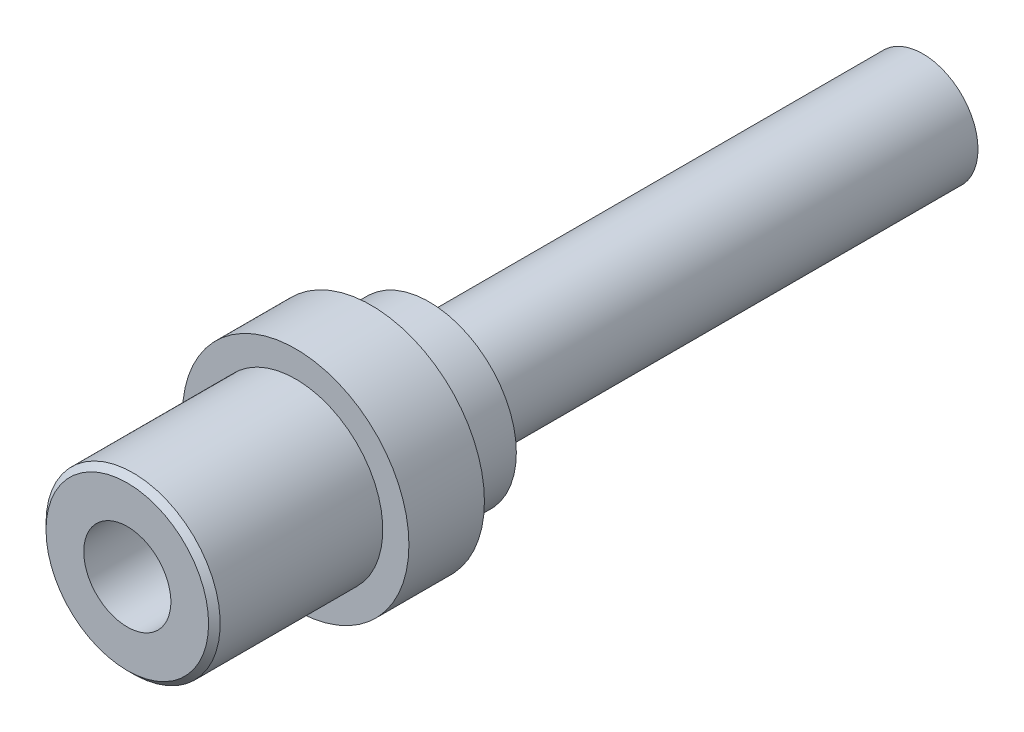
ISO-10303-21;
HEADER;
FILE_DESCRIPTION(('STEP AP214'),'2;1');
FILE_NAME('part.step','',(''),(''),'','','');
FILE_SCHEMA(('AUTOMOTIVE_DESIGN { 1 0 10303 214 1 1 1 1 }'));
ENDSEC;
DATA;
#1=APPLICATION_CONTEXT('core data for automotive mechanical design processes');
#2=APPLICATION_PROTOCOL_DEFINITION('international standard','automotive_design',2000,#1);
#3=PRODUCT_CONTEXT('',#1,'mechanical');
#4=PRODUCT('Part','Part','',(#3));
#5=PRODUCT_RELATED_PRODUCT_CATEGORY('part','',(#4));
#6=PRODUCT_DEFINITION_FORMATION('','',#4);
#7=PRODUCT_DEFINITION_CONTEXT('part definition',#1,'design');
#8=PRODUCT_DEFINITION('design','',#6,#7);
#9=PRODUCT_DEFINITION_SHAPE('','',#8);
#10=(LENGTH_UNIT() NAMED_UNIT(*) SI_UNIT(.MILLI.,.METRE.));
#11=(NAMED_UNIT(*) PLANE_ANGLE_UNIT() SI_UNIT($,.RADIAN.));
#12=(NAMED_UNIT(*) SI_UNIT($,.STERADIAN.) SOLID_ANGLE_UNIT());
#13=UNCERTAINTY_MEASURE_WITH_UNIT(LENGTH_MEASURE(1.E-05),#10,'distance_accuracy_value','');
#14=(GEOMETRIC_REPRESENTATION_CONTEXT(3) GLOBAL_UNCERTAINTY_ASSIGNED_CONTEXT((#13)) GLOBAL_UNIT_ASSIGNED_CONTEXT((#10,
#11,#12)) REPRESENTATION_CONTEXT('',''));
#15=CARTESIAN_POINT('',(0.,0.,0.));
#16=DIRECTION('',(0.,0.,1.));
#17=DIRECTION('',(1.,0.,0.));
#18=AXIS2_PLACEMENT_3D('',#15,#16,#17);
#19=CARTESIAN_POINT('',(0.,0.,85.));
#20=DIRECTION('',(0.,0.,-1.));
#21=DIRECTION('',(-1.,0.,0.));
#22=AXIS2_PLACEMENT_3D('',#19,#20,#21);
#23=CYLINDRICAL_SURFACE('',#22,9.5);
#24=CARTESIAN_POINT('',(0.,0.,85.));
#25=DIRECTION('',(0.,0.,1.));
#26=DIRECTION('',(1.,0.,0.));
#27=AXIS2_PLACEMENT_3D('',#24,#25,#26);
#28=CIRCLE('',#27,9.5);
#29=CARTESIAN_POINT('',(9.5,0.,85.));
#30=VERTEX_POINT('',#29);
#31=EDGE_CURVE('E62',#30,#30,#28,.T.);
#32=ORIENTED_EDGE('',*,*,#31,.F.);
#33=EDGE_LOOP('',(#32));
#34=FACE_BOUND('',#33,.T.);
#35=CARTESIAN_POINT('',(0.,0.,0.));
#36=DIRECTION('',(0.,0.,1.));
#37=DIRECTION('',(1.,0.,0.));
#38=AXIS2_PLACEMENT_3D('',#35,#36,#37);
#39=CIRCLE('',#38,9.5);
#40=CARTESIAN_POINT('',(9.5,0.,0.));
#41=VERTEX_POINT('',#40);
#42=EDGE_CURVE('E65',#41,#41,#39,.T.);
#43=ORIENTED_EDGE('',*,*,#42,.T.);
#44=EDGE_LOOP('',(#43));
#45=FACE_BOUND('',#44,.T.);
#46=ADVANCED_FACE('F43',(#34,#45),#23,.T.);
#47=CARTESIAN_POINT('',(0.,0.,0.));
#48=DIRECTION('',(0.,0.,1.));
#49=DIRECTION('',(1.,0.,0.));
#50=AXIS2_PLACEMENT_3D('',#47,#48,#49);
#51=PLANE('',#50);
#52=CARTESIAN_POINT('',(0.,0.,0.));
#53=DIRECTION('',(0.,0.,-1.));
#54=DIRECTION('',(-1.,0.,0.));
#55=AXIS2_PLACEMENT_3D('',#52,#53,#54);
#56=CIRCLE('',#55,7.5);
#57=CARTESIAN_POINT('',(-7.5,0.,0.));
#58=VERTEX_POINT('',#57);
#59=EDGE_CURVE('E89',#58,#58,#56,.T.);
#60=ORIENTED_EDGE('',*,*,#59,.F.);
#61=EDGE_LOOP('',(#60));
#62=FACE_BOUND('',#61,.T.);
#63=ORIENTED_EDGE('',*,*,#42,.F.);
#64=EDGE_LOOP('',(#63));
#65=FACE_BOUND('',#64,.T.);
#66=ADVANCED_FACE('F105',(#62,#65),#51,.F.);
#67=CARTESIAN_POINT('',(0.,0.,95.));
#68=DIRECTION('',(0.,0.,-1.));
#69=DIRECTION('',(-1.,0.,0.));
#70=AXIS2_PLACEMENT_3D('',#67,#68,#69);
#71=CYLINDRICAL_SURFACE('',#70,15.);
#72=CARTESIAN_POINT('',(0.,0.,95.));
#73=DIRECTION('',(0.,0.,1.));
#74=DIRECTION('',(1.,0.,0.));
#75=AXIS2_PLACEMENT_3D('',#72,#73,#74);
#76=CIRCLE('',#75,15.);
#77=CARTESIAN_POINT('',(15.,0.,95.));
#78=VERTEX_POINT('',#77);
#79=EDGE_CURVE('E69',#78,#78,#76,.T.);
#80=ORIENTED_EDGE('',*,*,#79,.F.);
#81=EDGE_LOOP('',(#80));
#82=FACE_BOUND('',#81,.T.);
#83=CARTESIAN_POINT('',(0.,0.,85.));
#84=DIRECTION('',(0.,0.,1.));
#85=DIRECTION('',(1.,0.,0.));
#86=AXIS2_PLACEMENT_3D('',#83,#84,#85);
#87=CIRCLE('',#86,15.);
#88=CARTESIAN_POINT('',(15.,0.,85.));
#89=VERTEX_POINT('',#88);
#90=EDGE_CURVE('E73',#89,#89,#87,.T.);
#91=ORIENTED_EDGE('',*,*,#90,.T.);
#92=EDGE_LOOP('',(#91));
#93=FACE_BOUND('',#92,.T.);
#94=ADVANCED_FACE('F108',(#82,#93),#71,.T.);
#95=CARTESIAN_POINT('',(0.,0.,85.));
#96=DIRECTION('',(0.,0.,1.));
#97=DIRECTION('',(1.,0.,0.));
#98=AXIS2_PLACEMENT_3D('',#95,#96,#97);
#99=PLANE('',#98);
#100=ORIENTED_EDGE('',*,*,#31,.T.);
#101=EDGE_LOOP('',(#100));
#102=FACE_BOUND('',#101,.T.);
#103=ORIENTED_EDGE('',*,*,#90,.F.);
#104=EDGE_LOOP('',(#103));
#105=FACE_BOUND('',#104,.T.);
#106=ADVANCED_FACE('F120',(#102,#105),#99,.F.);
#107=CARTESIAN_POINT('',(0.,0.,108.));
#108=DIRECTION('',(0.,0.,-1.));
#109=DIRECTION('',(-1.,0.,0.));
#110=AXIS2_PLACEMENT_3D('',#107,#108,#109);
#111=CYLINDRICAL_SURFACE('',#110,19.5);
#112=CARTESIAN_POINT('',(0.,0.,108.));
#113=DIRECTION('',(0.,0.,1.));
#114=DIRECTION('',(1.,0.,0.));
#115=AXIS2_PLACEMENT_3D('',#112,#113,#114);
#116=CIRCLE('',#115,19.5);
#117=CARTESIAN_POINT('',(-19.5,0.,108.));
#118=VERTEX_POINT('',#117);
#119=EDGE_CURVE('E77',#118,#118,#116,.T.);
#120=CARTESIAN_POINT('',(0.,0.,95.));
#121=DIRECTION('',(0.,0.,1.));
#122=DIRECTION('',(1.,0.,0.));
#123=AXIS2_PLACEMENT_3D('',#120,#121,#122);
#124=CIRCLE('',#123,19.5);
#125=CARTESIAN_POINT('',(-19.5,0.,95.));
#126=VERTEX_POINT('',#125);
#127=EDGE_CURVE('E81',#126,#126,#124,.T.);
#128=CARTESIAN_POINT('',(-19.5,0.,108.));
#129=CARTESIAN_POINT('',(-19.5,0.,107.864583333333));
#130=CARTESIAN_POINT('',(-19.5,0.,107.729166666667));
#131=CARTESIAN_POINT('',(-19.5,0.,107.458333333333));
#132=CARTESIAN_POINT('',(-19.5,0.,107.322916666667));
#133=CARTESIAN_POINT('',(-19.5,0.,107.052083333333));
#134=CARTESIAN_POINT('',(-19.5,0.,106.916666666667));
#135=CARTESIAN_POINT('',(-19.5,0.,106.645833333333));
#136=CARTESIAN_POINT('',(-19.5,0.,106.510416666667));
#137=CARTESIAN_POINT('',(-19.5,0.,106.239583333333));
#138=CARTESIAN_POINT('',(-19.5,0.,106.104166666667));
#139=CARTESIAN_POINT('',(-19.5,0.,105.833333333333));
#140=CARTESIAN_POINT('',(-19.5,0.,105.697916666667));
#141=CARTESIAN_POINT('',(-19.5,0.,105.427083333333));
#142=CARTESIAN_POINT('',(-19.5,0.,105.291666666667));
#143=CARTESIAN_POINT('',(-19.5,0.,105.020833333333));
#144=CARTESIAN_POINT('',(-19.5,0.,104.885416666667));
#145=CARTESIAN_POINT('',(-19.5,0.,104.614583333333));
#146=CARTESIAN_POINT('',(-19.5,0.,104.479166666667));
#147=CARTESIAN_POINT('',(-19.5,0.,104.208333333333));
#148=CARTESIAN_POINT('',(-19.5,0.,104.072916666667));
#149=CARTESIAN_POINT('',(-19.5,0.,103.802083333333));
#150=CARTESIAN_POINT('',(-19.5,0.,103.666666666667));
#151=CARTESIAN_POINT('',(-19.5,0.,103.395833333333));
#152=CARTESIAN_POINT('',(-19.5,0.,103.260416666667));
#153=CARTESIAN_POINT('',(-19.5,0.,102.989583333333));
#154=CARTESIAN_POINT('',(-19.5,0.,102.854166666667));
#155=CARTESIAN_POINT('',(-19.5,0.,102.583333333333));
#156=CARTESIAN_POINT('',(-19.5,0.,102.447916666667));
#157=CARTESIAN_POINT('',(-19.5,0.,102.177083333333));
#158=CARTESIAN_POINT('',(-19.5,0.,102.041666666667));
#159=CARTESIAN_POINT('',(-19.5,0.,101.770833333333));
#160=CARTESIAN_POINT('',(-19.5,0.,101.635416666667));
#161=CARTESIAN_POINT('',(-19.5,0.,101.364583333333));
#162=CARTESIAN_POINT('',(-19.5,0.,101.229166666667));
#163=CARTESIAN_POINT('',(-19.5,0.,100.958333333333));
#164=CARTESIAN_POINT('',(-19.5,0.,100.822916666667));
#165=CARTESIAN_POINT('',(-19.5,0.,100.552083333333));
#166=CARTESIAN_POINT('',(-19.5,0.,100.416666666667));
#167=CARTESIAN_POINT('',(-19.5,0.,100.145833333333));
#168=CARTESIAN_POINT('',(-19.5,0.,100.010416666667));
#169=CARTESIAN_POINT('',(-19.5,0.,99.7395833333333));
#170=CARTESIAN_POINT('',(-19.5,0.,99.6041666666667));
#171=CARTESIAN_POINT('',(-19.5,0.,99.3333333333333));
#172=CARTESIAN_POINT('',(-19.5,0.,99.1979166666667));
#173=CARTESIAN_POINT('',(-19.5,0.,98.9270833333333));
#174=CARTESIAN_POINT('',(-19.5,0.,98.7916666666667));
#175=CARTESIAN_POINT('',(-19.5,0.,98.5208333333333));
#176=CARTESIAN_POINT('',(-19.5,0.,98.3854166666667));
#177=CARTESIAN_POINT('',(-19.5,0.,98.1145833333333));
#178=CARTESIAN_POINT('',(-19.5,0.,97.9791666666667));
#179=CARTESIAN_POINT('',(-19.5,0.,97.7083333333333));
#180=CARTESIAN_POINT('',(-19.5,0.,97.5729166666667));
#181=CARTESIAN_POINT('',(-19.5,0.,97.3020833333333));
#182=CARTESIAN_POINT('',(-19.5,0.,97.1666666666667));
#183=CARTESIAN_POINT('',(-19.5,0.,96.8958333333333));
#184=CARTESIAN_POINT('',(-19.5,0.,96.7604166666667));
#185=CARTESIAN_POINT('',(-19.5,0.,96.4895833333333));
#186=CARTESIAN_POINT('',(-19.5,0.,96.3541666666667));
#187=CARTESIAN_POINT('',(-19.5,0.,96.0833333333333));
#188=CARTESIAN_POINT('',(-19.5,0.,95.9479166666667));
#189=CARTESIAN_POINT('',(-19.5,0.,95.6770833333333));
#190=CARTESIAN_POINT('',(-19.5,0.,95.5416666666667));
#191=CARTESIAN_POINT('',(-19.5,0.,95.2708333333333));
#192=CARTESIAN_POINT('',(-19.5,0.,95.1354166666667));
#193=CARTESIAN_POINT('',(-19.5,0.,95.));
#194=B_SPLINE_CURVE_WITH_KNOTS('',3,(#128,#129,#130,#131,#132,#133,#134,#135,#136,#137,#138,
#139,#140,#141,#142,#143,#144,#145,#146,#147,#148,#149,#150,#151,#152,#153,#154,#155,#156,#157,
#158,#159,#160,#161,#162,#163,#164,#165,#166,#167,#168,#169,#170,#171,#172,#173,#174,#175,#176,
#177,#178,#179,#180,#181,#182,#183,#184,#185,#186,#187,#188,#189,#190,#191,#192,#193),
.UNSPECIFIED.,.F.,.F.,(4,2,2,2,2,2,2,2,2,2,2,2,2,2,2,2,2,2,2,2,2,2,2,2,2,2,2,2,2,2,2,2,4),(0.,
0.406249999999997,0.812499999999994,1.21874999999999,1.62499999999999,2.03125,2.4375,
2.84374999999999,3.24999999999999,3.65625,4.0625,4.46874999999999,4.87499999999999,
5.28124999999999,5.6875,6.09374999999999,6.49999999999999,6.90624999999999,7.3125,7.71875,
8.12499999999999,8.53124999999999,8.93749999999999,9.34375,9.74999999999999,10.15625,10.5625,
10.96875,11.375,11.78125,12.1875,12.59375,13.),.UNSPECIFIED.);
#195=EDGE_CURVE('BSEAM124',#118,#126,#194,.T.);
#196=ORIENTED_EDGE('',*,*,#119,.F.);
#197=ORIENTED_EDGE('',*,*,#127,.T.);
#198=ORIENTED_EDGE('',*,*,#195,.T.);
#199=ORIENTED_EDGE('',*,*,#195,.F.);
#200=EDGE_LOOP('',(#196,#198,#197,#199));
#201=FACE_BOUND('',#200,.T.);
#202=ADVANCED_FACE('F124',(#201),#111,.T.);
#203=CARTESIAN_POINT('',(0.,0.,108.));
#204=DIRECTION('',(0.,0.,1.));
#205=DIRECTION('',(1.,0.,0.));
#206=AXIS2_PLACEMENT_3D('',#203,#204,#205);
#207=PLANE('',#206);
#208=CARTESIAN_POINT('',(0.,0.,108.));
#209=DIRECTION('',(0.,0.,1.));
#210=DIRECTION('',(1.,0.,0.));
#211=AXIS2_PLACEMENT_3D('',#208,#209,#210);
#212=CIRCLE('',#211,15.);
#213=CARTESIAN_POINT('',(-15.,0.,108.));
#214=VERTEX_POINT('',#213);
#215=EDGE_CURVE('E57',#214,#214,#212,.T.);
#216=ORIENTED_EDGE('',*,*,#215,.F.);
#217=EDGE_LOOP('',(#216));
#218=FACE_BOUND('',#217,.T.);
#219=ORIENTED_EDGE('',*,*,#119,.T.);
#220=EDGE_LOOP('',(#219));
#221=FACE_BOUND('',#220,.T.);
#222=ADVANCED_FACE('F128',(#218,#221),#207,.T.);
#223=CARTESIAN_POINT('',(0.,0.,95.));
#224=DIRECTION('',(0.,0.,1.));
#225=DIRECTION('',(1.,0.,0.));
#226=AXIS2_PLACEMENT_3D('',#223,#224,#225);
#227=PLANE('',#226);
#228=ORIENTED_EDGE('',*,*,#79,.T.);
#229=EDGE_LOOP('',(#228));
#230=FACE_BOUND('',#229,.T.);
#231=ORIENTED_EDGE('',*,*,#127,.F.);
#232=EDGE_LOOP('',(#231));
#233=FACE_BOUND('',#232,.T.);
#234=ADVANCED_FACE('F130',(#230,#233),#227,.F.);
#235=CARTESIAN_POINT('',(0.,0.,137.));
#236=DIRECTION('',(0.,0.,-1.));
#237=DIRECTION('',(-1.,0.,0.));
#238=AXIS2_PLACEMENT_3D('',#235,#236,#237);
#239=CYLINDRICAL_SURFACE('',#238,15.);
#240=CARTESIAN_POINT('',(0.,0.,136.));
#241=DIRECTION('',(0.,0.,1.));
#242=DIRECTION('',(1.,0.,0.));
#243=AXIS2_PLACEMENT_3D('',#240,#241,#242);
#244=CIRCLE('',#243,15.);
#245=CARTESIAN_POINT('',(-15.,0.,136.));
#246=VERTEX_POINT('',#245);
#247=EDGE_CURVE('E10',#246,#246,#244,.F.);
#248=CARTESIAN_POINT('',(-15.,0.,136.));
#249=CARTESIAN_POINT('',(-15.,0.,135.708333333333));
#250=CARTESIAN_POINT('',(-15.,0.,135.416666666667));
#251=CARTESIAN_POINT('',(-15.,0.,134.833333333333));
#252=CARTESIAN_POINT('',(-15.,0.,134.541666666667));
#253=CARTESIAN_POINT('',(-15.,0.,133.958333333333));
#254=CARTESIAN_POINT('',(-15.,0.,133.666666666667));
#255=CARTESIAN_POINT('',(-15.,0.,133.083333333333));
#256=CARTESIAN_POINT('',(-15.,0.,132.791666666667));
#257=CARTESIAN_POINT('',(-15.,0.,132.208333333333));
#258=CARTESIAN_POINT('',(-15.,0.,131.916666666667));
#259=CARTESIAN_POINT('',(-15.,0.,131.333333333333));
#260=CARTESIAN_POINT('',(-15.,0.,131.041666666667));
#261=CARTESIAN_POINT('',(-15.,0.,130.458333333333));
#262=CARTESIAN_POINT('',(-15.,0.,130.166666666667));
#263=CARTESIAN_POINT('',(-15.,0.,129.583333333333));
#264=CARTESIAN_POINT('',(-15.,0.,129.291666666667));
#265=CARTESIAN_POINT('',(-15.,0.,128.708333333333));
#266=CARTESIAN_POINT('',(-15.,0.,128.416666666667));
#267=CARTESIAN_POINT('',(-15.,0.,127.833333333333));
#268=CARTESIAN_POINT('',(-15.,0.,127.541666666667));
#269=CARTESIAN_POINT('',(-15.,0.,126.958333333333));
#270=CARTESIAN_POINT('',(-15.,0.,126.666666666667));
#271=CARTESIAN_POINT('',(-15.,0.,126.083333333333));
#272=CARTESIAN_POINT('',(-15.,0.,125.791666666667));
#273=CARTESIAN_POINT('',(-15.,0.,125.208333333333));
#274=CARTESIAN_POINT('',(-15.,0.,124.916666666667));
#275=CARTESIAN_POINT('',(-15.,0.,124.333333333333));
#276=CARTESIAN_POINT('',(-15.,0.,124.041666666667));
#277=CARTESIAN_POINT('',(-15.,0.,123.458333333333));
#278=CARTESIAN_POINT('',(-15.,0.,123.166666666667));
#279=CARTESIAN_POINT('',(-15.,0.,122.583333333333));
#280=CARTESIAN_POINT('',(-15.,0.,122.291666666667));
#281=CARTESIAN_POINT('',(-15.,0.,121.708333333333));
#282=CARTESIAN_POINT('',(-15.,0.,121.416666666667));
#283=CARTESIAN_POINT('',(-15.,0.,120.833333333333));
#284=CARTESIAN_POINT('',(-15.,0.,120.541666666667));
#285=CARTESIAN_POINT('',(-15.,0.,119.958333333333));
#286=CARTESIAN_POINT('',(-15.,0.,119.666666666667));
#287=CARTESIAN_POINT('',(-15.,0.,119.083333333333));
#288=CARTESIAN_POINT('',(-15.,0.,118.791666666667));
#289=CARTESIAN_POINT('',(-15.,0.,118.208333333333));
#290=CARTESIAN_POINT('',(-15.,0.,117.916666666667));
#291=CARTESIAN_POINT('',(-15.,0.,117.333333333333));
#292=CARTESIAN_POINT('',(-15.,0.,117.041666666667));
#293=CARTESIAN_POINT('',(-15.,0.,116.458333333333));
#294=CARTESIAN_POINT('',(-15.,0.,116.166666666667));
#295=CARTESIAN_POINT('',(-15.,0.,115.583333333333));
#296=CARTESIAN_POINT('',(-15.,0.,115.291666666667));
#297=CARTESIAN_POINT('',(-15.,0.,114.708333333333));
#298=CARTESIAN_POINT('',(-15.,0.,114.416666666667));
#299=CARTESIAN_POINT('',(-15.,0.,113.833333333333));
#300=CARTESIAN_POINT('',(-15.,0.,113.541666666667));
#301=CARTESIAN_POINT('',(-15.,0.,112.958333333333));
#302=CARTESIAN_POINT('',(-15.,0.,112.666666666667));
#303=CARTESIAN_POINT('',(-15.,0.,112.083333333333));
#304=CARTESIAN_POINT('',(-15.,0.,111.791666666667));
#305=CARTESIAN_POINT('',(-15.,0.,111.208333333333));
#306=CARTESIAN_POINT('',(-15.,0.,110.916666666667));
#307=CARTESIAN_POINT('',(-15.,0.,110.333333333333));
#308=CARTESIAN_POINT('',(-15.,0.,110.041666666667));
#309=CARTESIAN_POINT('',(-15.,0.,109.458333333333));
#310=CARTESIAN_POINT('',(-15.,0.,109.166666666667));
#311=CARTESIAN_POINT('',(-15.,0.,108.583333333333));
#312=CARTESIAN_POINT('',(-15.,0.,108.291666666667));
#313=CARTESIAN_POINT('',(-15.,0.,108.));
#314=B_SPLINE_CURVE_WITH_KNOTS('',3,(#248,#249,#250,#251,#252,#253,#254,#255,#256,#257,#258,
#259,#260,#261,#262,#263,#264,#265,#266,#267,#268,#269,#270,#271,#272,#273,#274,#275,#276,#277,
#278,#279,#280,#281,#282,#283,#284,#285,#286,#287,#288,#289,#290,#291,#292,#293,#294,#295,#296,
#297,#298,#299,#300,#301,#302,#303,#304,#305,#306,#307,#308,#309,#310,#311,#312,#313),
.UNSPECIFIED.,.F.,.F.,(4,2,2,2,2,2,2,2,2,2,2,2,2,2,2,2,2,2,2,2,2,2,2,2,2,2,2,2,2,2,2,2,4),(0.,
0.874999999999987,1.75,2.62499999999999,3.5,4.37499999999999,5.25,6.12499999999999,
7.00000000000001,7.87499999999999,8.75000000000001,9.62499999999999,10.5,11.375,12.25,13.125,
14.,14.875,15.75,16.625,17.5,18.375,19.25,20.125,21.,21.875,22.75,23.625,24.5,25.375,26.25,
27.125,28.),.UNSPECIFIED.);
#315=EDGE_CURVE('BSEAM133',#246,#214,#314,.T.);
#316=ORIENTED_EDGE('',*,*,#247,.T.);
#317=ORIENTED_EDGE('',*,*,#215,.T.);
#318=ORIENTED_EDGE('',*,*,#315,.T.);
#319=ORIENTED_EDGE('',*,*,#315,.F.);
#320=EDGE_LOOP('',(#316,#318,#317,#319));
#321=FACE_BOUND('',#320,.T.);
#322=ADVANCED_FACE('F133',(#321),#239,.T.);
#323=CARTESIAN_POINT('',(0.,0.,137.));
#324=DIRECTION('',(0.,0.,1.));
#325=DIRECTION('',(1.,0.,0.));
#326=AXIS2_PLACEMENT_3D('',#323,#324,#325);
#327=PLANE('',#326);
#328=CARTESIAN_POINT('',(0.,0.,137.));
#329=DIRECTION('',(0.,0.,-1.));
#330=DIRECTION('',(-1.,0.,0.));
#331=AXIS2_PLACEMENT_3D('',#328,#329,#330);
#332=CIRCLE('',#331,7.5);
#333=CARTESIAN_POINT('',(-7.5,0.,137.));
#334=VERTEX_POINT('',#333);
#335=EDGE_CURVE('E85',#334,#334,#332,.T.);
#336=ORIENTED_EDGE('',*,*,#335,.T.);
#337=EDGE_LOOP('',(#336));
#338=FACE_BOUND('',#337,.T.);
#339=CARTESIAN_POINT('',(0.,0.,137.));
#340=DIRECTION('',(0.,0.,1.));
#341=DIRECTION('',(1.,0.,0.));
#342=AXIS2_PLACEMENT_3D('',#339,#340,#341);
#343=CIRCLE('',#342,14.);
#344=CARTESIAN_POINT('',(14.,0.,137.));
#345=VERTEX_POINT('',#344);
#346=EDGE_CURVE('E52',#345,#345,#343,.T.);
#347=ORIENTED_EDGE('',*,*,#346,.T.);
#348=EDGE_LOOP('',(#347));
#349=FACE_BOUND('',#348,.T.);
#350=ADVANCED_FACE('F97',(#338,#349),#327,.T.);
#351=CARTESIAN_POINT('',(0.,0.,137.));
#352=DIRECTION('',(0.,0.,-1.));
#353=DIRECTION('',(-1.,0.,0.));
#354=AXIS2_PLACEMENT_3D('',#351,#352,#353);
#355=CONICAL_SURFACE('',#354,14.,0.785398163397457);
#356=ORIENTED_EDGE('',*,*,#247,.F.);
#357=EDGE_LOOP('',(#356));
#358=FACE_BOUND('',#357,.T.);
#359=ORIENTED_EDGE('',*,*,#346,.F.);
#360=EDGE_LOOP('',(#359));
#361=FACE_BOUND('',#360,.T.);
#362=ADVANCED_FACE('F46',(#358,#361),#355,.T.);
#363=CARTESIAN_POINT('',(0.,0.,137.));
#364=DIRECTION('',(0.,0.,-1.));
#365=DIRECTION('',(-1.,0.,0.));
#366=AXIS2_PLACEMENT_3D('',#363,#364,#365);
#367=CYLINDRICAL_SURFACE('',#366,7.5);
#368=ORIENTED_EDGE('',*,*,#335,.F.);
#369=EDGE_LOOP('',(#368));
#370=FACE_BOUND('',#369,.T.);
#371=ORIENTED_EDGE('',*,*,#59,.T.);
#372=EDGE_LOOP('',(#371));
#373=FACE_BOUND('',#372,.T.);
#374=ADVANCED_FACE('F99',(#370,#373),#367,.F.);
#375=CLOSED_SHELL('',(#46,#66,#94,#106,#202,#222,#234,#322,#350,#362,#374));
#376=MANIFOLD_SOLID_BREP('B2',#375);
#377=ADVANCED_BREP_SHAPE_REPRESENTATION('',(#18,#376),#14);
#378=SHAPE_DEFINITION_REPRESENTATION(#9,#377);
ENDSEC;
END-ISO-10303-21;
